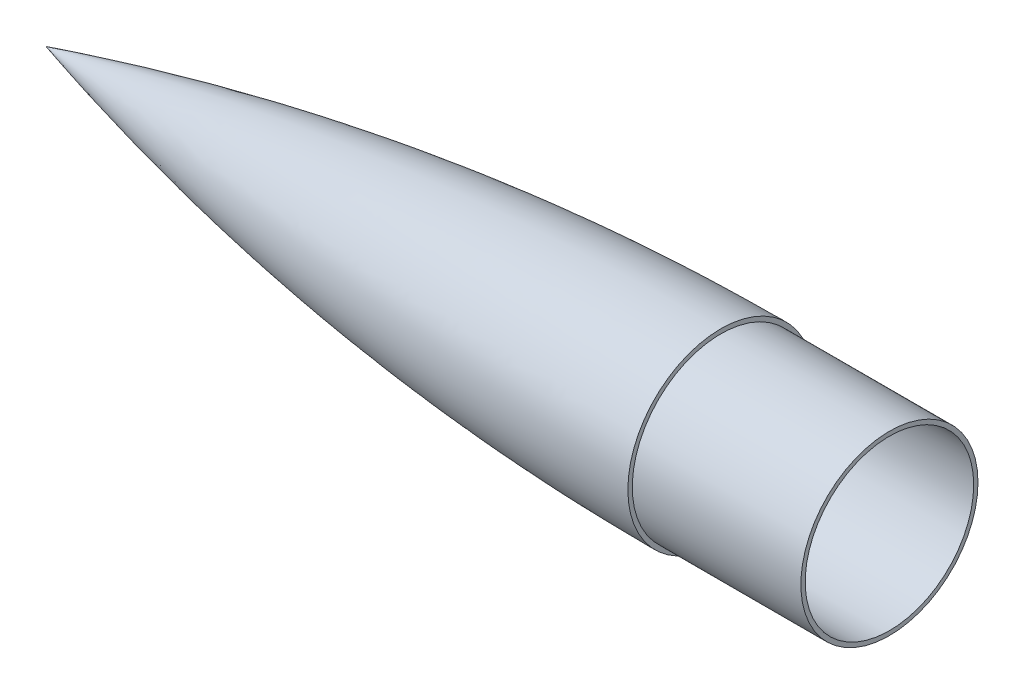
ISO-10303-21;
HEADER;
FILE_DESCRIPTION(('STEP AP214'),'2;1');
FILE_NAME('part.step','',(''),(''),'','','');
FILE_SCHEMA(('AUTOMOTIVE_DESIGN { 1 0 10303 214 1 1 1 1 }'));
ENDSEC;
DATA;
#1=APPLICATION_CONTEXT('core data for automotive mechanical design processes');
#2=APPLICATION_PROTOCOL_DEFINITION('international standard','automotive_design',2000,#1);
#3=PRODUCT_CONTEXT('',#1,'mechanical');
#4=PRODUCT('Part','Part','',(#3));
#5=PRODUCT_RELATED_PRODUCT_CATEGORY('part','',(#4));
#6=PRODUCT_DEFINITION_FORMATION('','',#4);
#7=PRODUCT_DEFINITION_CONTEXT('part definition',#1,'design');
#8=PRODUCT_DEFINITION('design','',#6,#7);
#9=PRODUCT_DEFINITION_SHAPE('','',#8);
#10=(LENGTH_UNIT() NAMED_UNIT(*) SI_UNIT(.MILLI.,.METRE.));
#11=(NAMED_UNIT(*) PLANE_ANGLE_UNIT() SI_UNIT($,.RADIAN.));
#12=(NAMED_UNIT(*) SI_UNIT($,.STERADIAN.) SOLID_ANGLE_UNIT());
#13=UNCERTAINTY_MEASURE_WITH_UNIT(LENGTH_MEASURE(1.E-05),#10,'distance_accuracy_value','');
#14=(GEOMETRIC_REPRESENTATION_CONTEXT(3) GLOBAL_UNCERTAINTY_ASSIGNED_CONTEXT((#13)) GLOBAL_UNIT_ASSIGNED_CONTEXT((#10,
#11,#12)) REPRESENTATION_CONTEXT('',''));
#15=CARTESIAN_POINT('',(0.,0.,0.));
#16=DIRECTION('',(0.,0.,1.));
#17=DIRECTION('',(1.,0.,0.));
#18=AXIS2_PLACEMENT_3D('',#15,#16,#17);
#19=CARTESIAN_POINT('',(285.749999997285,0.,0.));
#20=DIRECTION('',(-1.,0.,0.));
#21=DIRECTION('',(0.,-1.,0.));
#22=AXIS2_PLACEMENT_3D('',#19,#20,#21);
#23=PLANE('',#22);
#24=CARTESIAN_POINT('',(285.749999997285,0.,0.));
#25=DIRECTION('',(-1.,0.,0.));
#26=DIRECTION('',(0.,-1.,0.));
#27=AXIS2_PLACEMENT_3D('',#24,#25,#26);
#28=CIRCLE('',#27,37.5);
#29=CARTESIAN_POINT('',(285.749999997285,-37.5,0.));
#30=VERTEX_POINT('',#29);
#31=EDGE_CURVE('E105',#30,#30,#28,.T.);
#32=ORIENTED_EDGE('',*,*,#31,.T.);
#33=EDGE_LOOP('',(#32));
#34=FACE_BOUND('',#33,.T.);
#35=CARTESIAN_POINT('',(285.749999997285,0.000773686166673862,0.));
#36=DIRECTION('',(-1.,0.,0.));
#37=DIRECTION('',(0.,-1.,0.));
#38=AXIS2_PLACEMENT_3D('',#35,#36,#37);
#39=CIRCLE('',#38,39.3692263151258);
#40=CARTESIAN_POINT('',(285.749999997285,-39.3684526289591,0.));
#41=VERTEX_POINT('',#40);
#42=EDGE_CURVE('E57',#41,#41,#39,.T.);
#43=ORIENTED_EDGE('',*,*,#42,.F.);
#44=EDGE_LOOP('',(#43));
#45=FACE_BOUND('',#44,.T.);
#46=ADVANCED_FACE('F47',(#34,#45),#23,.F.);
#47=CARTESIAN_POINT('',(-1.40657559398568E-10,0.000773686165071195,0.));
#48=CARTESIAN_POINT('',(0.34583708112579,0.0979130387497536,0.));
#49=CARTESIAN_POINT('',(1.04886177426057,0.294893917496231,0.));
#50=CARTESIAN_POINT('',(2.65880478333957,0.744910728478714,0.));
#51=CARTESIAN_POINT('',(4.05355792676487,1.1308397419369,0.));
#52=CARTESIAN_POINT('',(5.85911048083051,1.62923896381674,0.));
#53=CARTESIAN_POINT('',(7.44493389954091,2.06300440485525,0.));
#54=CARTESIAN_POINT('',(9.56110704100072,2.63917477606043,0.));
#55=CARTESIAN_POINT('',(12.0317319051814,3.30542777731976,0.));
#56=CARTESIAN_POINT('',(14.9586446198504,4.08672279626881,0.));
#57=CARTESIAN_POINT('',(18.2812880296208,4.96167734773777,0.));
#58=CARTESIAN_POINT('',(21.6195386341767,5.82935392610904,0.));
#59=CARTESIAN_POINT('',(25.7881377045731,6.89818970484769,0.));
#60=CARTESIAN_POINT('',(30.8003560227135,8.16025293641554,0.));
#61=CARTESIAN_POINT('',(35.8167081359698,9.39433063721685,0.));
#62=CARTESIAN_POINT('',(40.8413423654011,10.6015941933621,0.));
#63=CARTESIAN_POINT('',(45.8703072899831,11.7867662394909,0.));
#64=CARTESIAN_POINT('',(50.9048233462697,12.9501927997441,0.));
#65=CARTESIAN_POINT('',(56.7854477946102,14.2755178379974,0.));
#66=CARTESIAN_POINT('',(65.1986967461235,16.1140813781158,0.));
#67=CARTESIAN_POINT('',(73.6275969871571,17.8794323124566,0.));
#68=CARTESIAN_POINT('',(82.0715825298997,19.571461259087,0.));
#69=CARTESIAN_POINT('',(92.2215008132001,21.5137093153932,0.));
#70=CARTESIAN_POINT('',(109.165721028648,24.6036533071957,0.));
#71=CARTESIAN_POINT('',(127.869230817879,27.6377443844893,0.));
#72=CARTESIAN_POINT('',(146.634286906375,30.2646495399869,0.));
#73=CARTESIAN_POINT('',(163.735036765682,32.3184467277515,0.));
#74=CARTESIAN_POINT('',(174.005722775747,33.4614759385437,0.));
#75=CARTESIAN_POINT('',(184.286037163586,34.5151915313252,0.));
#76=CARTESIAN_POINT('',(194.577348101726,35.4571505652436,0.));
#77=CARTESIAN_POINT('',(204.878113597174,36.2872196849647,0.));
#78=CARTESIAN_POINT('',(213.467762548943,36.9042934086844,0.));
#79=CARTESIAN_POINT('',(220.342435031258,37.3531411058309,0.));
#80=CARTESIAN_POINT('',(227.220133714653,37.7571584104663,0.));
#81=CARTESIAN_POINT('',(233.239870853225,38.0714319479376,0.));
#82=CARTESIAN_POINT('',(238.401716287911,38.3127700037335,0.));
#83=CARTESIAN_POINT('',(242.702957325339,38.4951880396603,0.));
#84=CARTESIAN_POINT('',(246.146416963545,38.6299027077199,0.));
#85=CARTESIAN_POINT('',(249.586229398732,38.7533961856462,0.));
#86=CARTESIAN_POINT('',(253.033645651905,38.8656671594143,0.));
#87=CARTESIAN_POINT('',(256.46919635005,38.9667144364708,0.));
#88=CARTESIAN_POINT('',(259.925366912996,39.056536942447,0.));
#89=CARTESIAN_POINT('',(263.34822653357,39.1351337232531,0.));
#90=CARTESIAN_POINT('',(266.826889881775,39.2025039434801,0.));
#91=CARTESIAN_POINT('',(270.213132828486,39.2586468872677,0.));
#92=CARTESIAN_POINT('',(273.757700949584,39.3035619580313,0.));
#93=CARTESIAN_POINT('',(276.606326241479,39.3330378385719,0.));
#94=CARTESIAN_POINT('',(279.440738031803,39.3512849364782,0.));
#95=CARTESIAN_POINT('',(281.59883818537,39.3639175909115,0.));
#96=CARTESIAN_POINT('',(283.944232780956,39.3685963683977,0.));
#97=CARTESIAN_POINT('',(285.031559311314,39.3700000016436,0.));
#98=CARTESIAN_POINT('',(285.749999999863,39.3700000016476,0.));
#99=B_SPLINE_CURVE_WITH_KNOTS('',4,(#47,#48,#49,#50,#51,#52,#53,#54,#55,#56,#57,#58,#59,#60,#61,
#62,#63,#64,#65,#66,#67,#68,#69,#70,#71,#72,#73,#74,#75,#76,#77,#78,#79,#80,#81,#82,#83,#84,#85,
#86,#87,#88,#89,#90,#91,#92,#93,#94,#95,#96,#97,#98),.UNSPECIFIED.,.F.,.F.,(5,1,1,1,1,1,1,1,1,1,
1,1,1,1,1,1,1,1,1,1,1,1,1,1,1,1,1,1,1,1,1,1,1,1,1,1,1,1,1,1,1,1,1,1,1,1,1,1,5),
(0.0833391838370054,0.0883050372864794,0.0932708907359534,0.0982367441854274,0.103202597634901,
0.108168451084375,0.113134304533849,0.123066011432797,0.132997715255706,0.142929419078615,
0.152861122901524,0.162792826724433,0.182656229877916,0.202519633031399,0.21245133818824,
0.222383043345081,0.242246453658762,0.262109862770104,0.281973271881446,0.321700076033179,
0.34156348809067,0.361426900148161,0.40115371520501,0.520334158278695,0.560060970140976,
0.579924378811965,0.599787787482953,0.639514600870937,0.679241414296932,0.699104822751809,
0.718968231206687,0.738831638014097,0.758695044821507,0.778558452109981,0.788490155754217,
0.798421859398454,0.808353563178473,0.818285266958491,0.82821697073851,0.838148674518528,
0.848080378264371,0.858012082010213,0.867943785756055,0.877875489501898,0.887807193136724,
0.897738896771551,0.902704748588964,0.907670600406377,0.917602304031135),.UNSPECIFIED.);
#100=CARTESIAN_POINT('',(-1.34947608643188E-10,0.000773686166674614,0.));
#101=DIRECTION('',(-1.,0.,0.));
#102=AXIS1_PLACEMENT('',#100,#101);
#103=SURFACE_OF_REVOLUTION('',#99,#102);
#104=ORIENTED_EDGE('',*,*,#42,.T.);
#105=EDGE_LOOP('',(#104));
#106=FACE_BOUND('',#105,.T.);
#107=CARTESIAN_POINT('',(-1.3494760864115E-10,0.000773686166674614,0.));
#108=VERTEX_POINT('',#107);
#109=VERTEX_LOOP('',#108);
#110=FACE_BOUND('',#109,.T.);
#111=ADVANCED_FACE('F71',(#106,#110),#103,.F.);
#112=CARTESIAN_POINT('',(275.749999997285,0.,0.));
#113=DIRECTION('',(1.,0.,0.));
#114=DIRECTION('',(0.,0.,-1.));
#115=AXIS2_PLACEMENT_3D('',#112,#113,#114);
#116=PLANE('',#115);
#117=CARTESIAN_POINT('',(275.749999997285,0.,0.));
#118=DIRECTION('',(1.,0.,0.));
#119=DIRECTION('',(0.,0.,-1.));
#120=AXIS2_PLACEMENT_3D('',#117,#118,#119);
#121=CIRCLE('',#120,35.68);
#122=CARTESIAN_POINT('',(275.749999997285,0.,-35.68));
#123=VERTEX_POINT('',#122);
#124=EDGE_CURVE('E107',#123,#123,#121,.T.);
#125=ORIENTED_EDGE('',*,*,#124,.T.);
#126=EDGE_LOOP('',(#125));
#127=FACE_BOUND('',#126,.T.);
#128=CARTESIAN_POINT('',(275.749999997285,0.000773686166673888,0.));
#129=DIRECTION('',(-1.,0.,0.));
#130=DIRECTION('',(0.,-1.,0.));
#131=AXIS2_PLACEMENT_3D('',#128,#129,#130);
#132=CIRCLE('',#131,37.3620894866835);
#133=CARTESIAN_POINT('',(275.749999997285,-37.3613158005168,0.));
#134=VERTEX_POINT('',#133);
#135=EDGE_CURVE('E11',#134,#134,#132,.T.);
#136=ORIENTED_EDGE('',*,*,#135,.T.);
#137=EDGE_LOOP('',(#136));
#138=FACE_BOUND('',#137,.T.);
#139=ADVANCED_FACE('F68',(#127,#138),#116,.F.);
#140=CARTESIAN_POINT('',(275.749999997285,0.,0.));
#141=DIRECTION('',(1.,0.,0.));
#142=DIRECTION('',(0.,0.,-1.));
#143=AXIS2_PLACEMENT_3D('',#140,#141,#142);
#144=CYLINDRICAL_SURFACE('',#143,37.5);
#145=CARTESIAN_POINT('',(357.149999997285,0.,0.));
#146=DIRECTION('',(1.,0.,0.));
#147=DIRECTION('',(0.,0.,-1.));
#148=AXIS2_PLACEMENT_3D('',#145,#146,#147);
#149=CIRCLE('',#148,37.5);
#150=CARTESIAN_POINT('',(357.149999997285,0.,-37.5));
#151=VERTEX_POINT('',#150);
#152=EDGE_CURVE('E110',#151,#151,#149,.T.);
#153=ORIENTED_EDGE('',*,*,#152,.F.);
#154=EDGE_LOOP('',(#153));
#155=FACE_BOUND('',#154,.T.);
#156=ORIENTED_EDGE('',*,*,#31,.F.);
#157=EDGE_LOOP('',(#156));
#158=FACE_BOUND('',#157,.T.);
#159=ADVANCED_FACE('F70',(#155,#158),#144,.T.);
#160=CARTESIAN_POINT('',(275.749999997285,0.,0.));
#161=DIRECTION('',(1.,0.,0.));
#162=DIRECTION('',(0.,0.,-1.));
#163=AXIS2_PLACEMENT_3D('',#160,#161,#162);
#164=CYLINDRICAL_SURFACE('',#163,35.68);
#165=ORIENTED_EDGE('',*,*,#124,.F.);
#166=EDGE_LOOP('',(#165));
#167=FACE_BOUND('',#166,.T.);
#168=CARTESIAN_POINT('',(357.149999997285,0.,0.));
#169=DIRECTION('',(1.,0.,0.));
#170=DIRECTION('',(0.,0.,-1.));
#171=AXIS2_PLACEMENT_3D('',#168,#169,#170);
#172=CIRCLE('',#171,35.68);
#173=CARTESIAN_POINT('',(357.149999997285,0.,-35.68));
#174=VERTEX_POINT('',#173);
#175=EDGE_CURVE('E114',#174,#174,#172,.T.);
#176=ORIENTED_EDGE('',*,*,#175,.T.);
#177=EDGE_LOOP('',(#176));
#178=FACE_BOUND('',#177,.T.);
#179=ADVANCED_FACE('F78',(#167,#178),#164,.F.);
#180=CARTESIAN_POINT('',(357.149999997285,0.,0.));
#181=DIRECTION('',(1.,0.,0.));
#182=DIRECTION('',(0.,0.,-1.));
#183=AXIS2_PLACEMENT_3D('',#180,#181,#182);
#184=PLANE('',#183);
#185=ORIENTED_EDGE('',*,*,#152,.T.);
#186=EDGE_LOOP('',(#185));
#187=FACE_BOUND('',#186,.T.);
#188=ORIENTED_EDGE('',*,*,#175,.F.);
#189=EDGE_LOOP('',(#188));
#190=FACE_BOUND('',#189,.T.);
#191=ADVANCED_FACE('F65',(#187,#190),#184,.T.);
#192=CARTESIAN_POINT('',(7.07220514067732,0.00077368614926579,0.));
#193=CARTESIAN_POINT('',(7.37488273034127,0.0834914251687972,0.));
#194=CARTESIAN_POINT('',(8.08776371368763,0.278009604798348,0.));
#195=CARTESIAN_POINT('',(9.6680246392895,0.708007226832096,0.));
#196=CARTESIAN_POINT('',(12.0317319052452,1.34542777694218,0.));
#197=CARTESIAN_POINT('',(14.9586446199139,2.12672279589129,0.));
#198=CARTESIAN_POINT('',(18.2812880296838,3.00167734736065,0.));
#199=CARTESIAN_POINT('',(21.6195386342404,3.86935392573211,0.));
#200=CARTESIAN_POINT('',(25.7881377046362,4.93818970447118,0.));
#201=CARTESIAN_POINT('',(30.8003560227767,6.20025293603938,0.));
#202=CARTESIAN_POINT('',(35.8167081360326,7.43433063684117,0.));
#203=CARTESIAN_POINT('',(40.841342365464,8.64159419298676,0.));
#204=CARTESIAN_POINT('',(45.870307290046,9.82676623911591,0.));
#205=CARTESIAN_POINT('',(50.9048233463323,10.9901927993697,0.));
#206=CARTESIAN_POINT('',(56.7854477946731,12.3155178376233,0.));
#207=CARTESIAN_POINT('',(65.1986967461855,14.1540813777425,0.));
#208=CARTESIAN_POINT('',(73.6275969872198,15.9194323120839,0.));
#209=CARTESIAN_POINT('',(82.071582529962,17.6114612587152,0.));
#210=CARTESIAN_POINT('',(92.2215008132621,19.553709315022,0.));
#211=CARTESIAN_POINT('',(109.16572102871,22.6436533068261,0.));
#212=CARTESIAN_POINT('',(127.86923081794,25.6777443841212,0.));
#213=CARTESIAN_POINT('',(146.634286906436,28.3046495396203,0.));
#214=CARTESIAN_POINT('',(163.735036765744,30.3584467273861,0.));
#215=CARTESIAN_POINT('',(174.005722775808,31.5014759381794,0.));
#216=CARTESIAN_POINT('',(184.286037163647,32.5551915309615,0.));
#217=CARTESIAN_POINT('',(194.577348101787,33.4971505648804,0.));
#218=CARTESIAN_POINT('',(204.878113597235,34.3272196846029,0.));
#219=CARTESIAN_POINT('',(213.467762549003,34.9442934083233,0.));
#220=CARTESIAN_POINT('',(220.342435031318,35.3931411054704,0.));
#221=CARTESIAN_POINT('',(227.220133714714,35.7971584101066,0.));
#222=CARTESIAN_POINT('',(233.239870853285,36.1114319475781,0.));
#223=CARTESIAN_POINT('',(238.401716287971,36.3527700033748,0.));
#224=CARTESIAN_POINT('',(242.702957325399,36.5351880393019,0.));
#225=CARTESIAN_POINT('',(246.146416963605,36.6699027073615,0.));
#226=CARTESIAN_POINT('',(249.586229398792,36.7933961852876,0.));
#227=CARTESIAN_POINT('',(253.033645651965,36.9056671590565,0.));
#228=CARTESIAN_POINT('',(256.46919635011,37.006714436113,0.));
#229=CARTESIAN_POINT('',(259.925366913056,37.0965369420899,0.));
#230=CARTESIAN_POINT('',(263.34822653363,37.175133722896,0.));
#231=CARTESIAN_POINT('',(266.826889881835,37.2425039431236,0.));
#232=CARTESIAN_POINT('',(270.213132828545,37.2986468869111,0.));
#233=CARTESIAN_POINT('',(273.757700949644,37.3435619576747,0.));
#234=CARTESIAN_POINT('',(276.606326241539,37.3730378382158,0.));
#235=CARTESIAN_POINT('',(279.440738031863,37.3912849361225,0.));
#236=CARTESIAN_POINT('',(281.59883818543,37.4039175905559,0.));
#237=CARTESIAN_POINT('',(283.944232781016,37.4085963680423,0.));
#238=CARTESIAN_POINT('',(285.031559311374,37.4100000012883,0.));
#239=CARTESIAN_POINT('',(285.749999999923,37.4100000012924,0.));
#240=B_SPLINE_CURVE_WITH_KNOTS('',4,(#192,#193,#194,#195,#196,#197,#198,#199,#200,#201,#202,
#203,#204,#205,#206,#207,#208,#209,#210,#211,#212,#213,#214,#215,#216,#217,#218,#219,#220,#221,
#222,#223,#224,#225,#226,#227,#228,#229,#230,#231,#232,#233,#234,#235,#236,#237,#238,#239),
.UNSPECIFIED.,.F.,.F.,(5,1,1,1,1,1,1,1,1,1,1,1,1,1,1,1,1,1,1,1,1,1,1,1,1,1,1,1,1,1,1,1,1,1,1,1,
1,1,1,1,1,1,1,1,5),(0.104491997114785,0.108168451084375,0.113134304533849,0.123066011432797,
0.132997715255706,0.142929419078615,0.152861122901524,0.162792826724433,0.182656229877916,
0.202519633031399,0.21245133818824,0.222383043345081,0.242246453658762,0.262109862770104,
0.281973271881446,0.321700076033179,0.34156348809067,0.361426900148161,0.40115371520501,
0.520334158278695,0.560060970140976,0.579924378811965,0.599787787482953,0.639514600870937,
0.679241414296932,0.699104822751809,0.718968231206687,0.738831638014097,0.758695044821507,
0.778558452109981,0.788490155754217,0.798421859398454,0.808353563178473,0.818285266958491,
0.82821697073851,0.838148674518528,0.848080378264371,0.858012082010213,0.867943785756055,
0.877875489501898,0.887807193136724,0.897738896771551,0.902704748588964,0.907670600406377,
0.917602304030929),.UNSPECIFIED.);
#241=CARTESIAN_POINT('',(-1.34947608643188E-10,0.000773686166674614,0.));
#242=DIRECTION('',(-1.,0.,0.));
#243=AXIS1_PLACEMENT('',#241,#242);
#244=SURFACE_OF_REVOLUTION('',#240,#243);
#245=CARTESIAN_POINT('',(7.07220514067732,0.000773686166674596,0.));
#246=VERTEX_POINT('',#245);
#247=VERTEX_LOOP('',#246);
#248=FACE_BOUND('',#247,.T.);
#249=ORIENTED_EDGE('',*,*,#135,.F.);
#250=EDGE_LOOP('',(#249));
#251=FACE_BOUND('',#250,.T.);
#252=ADVANCED_FACE('F49',(#248,#251),#244,.T.);
#253=CLOSED_SHELL('',(#46,#111,#139,#159,#179,#191,#252));
#254=MANIFOLD_SOLID_BREP('B2',#253);
#255=ADVANCED_BREP_SHAPE_REPRESENTATION('',(#18,#254),#14);
#256=SHAPE_DEFINITION_REPRESENTATION(#9,#255);
ENDSEC;
END-ISO-10303-21;
